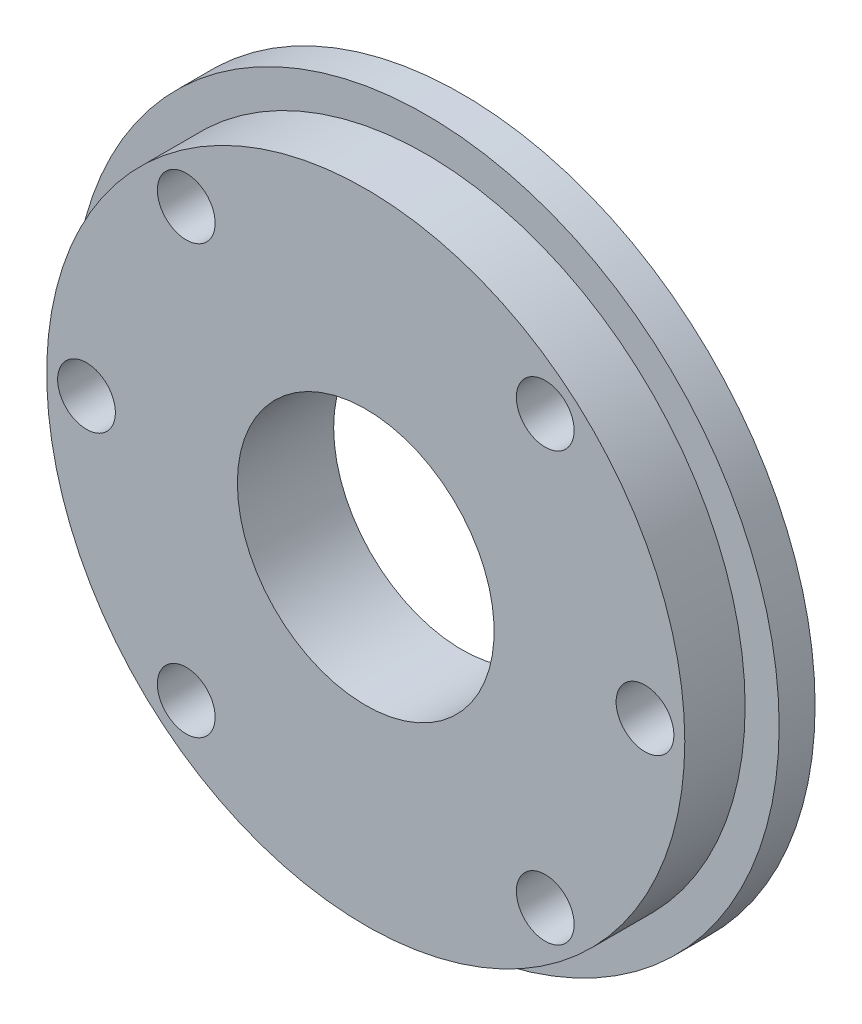
ISO-10303-21;
HEADER;
FILE_DESCRIPTION(('STEP AP214'),'2;1');
FILE_NAME('part.step','',(''),(''),'','','');
FILE_SCHEMA(('AUTOMOTIVE_DESIGN { 1 0 10303 214 1 1 1 1 }'));
ENDSEC;
DATA;
#1=APPLICATION_CONTEXT('core data for automotive mechanical design processes');
#2=APPLICATION_PROTOCOL_DEFINITION('international standard','automotive_design',2000,#1);
#3=PRODUCT_CONTEXT('',#1,'mechanical');
#4=PRODUCT('Part','Part','',(#3));
#5=PRODUCT_RELATED_PRODUCT_CATEGORY('part','',(#4));
#6=PRODUCT_DEFINITION_FORMATION('','',#4);
#7=PRODUCT_DEFINITION_CONTEXT('part definition',#1,'design');
#8=PRODUCT_DEFINITION('design','',#6,#7);
#9=PRODUCT_DEFINITION_SHAPE('','',#8);
#10=(LENGTH_UNIT() NAMED_UNIT(*) SI_UNIT(.MILLI.,.METRE.));
#11=(NAMED_UNIT(*) PLANE_ANGLE_UNIT() SI_UNIT($,.RADIAN.));
#12=(NAMED_UNIT(*) SI_UNIT($,.STERADIAN.) SOLID_ANGLE_UNIT());
#13=UNCERTAINTY_MEASURE_WITH_UNIT(LENGTH_MEASURE(1.E-05),#10,'distance_accuracy_value','');
#14=(GEOMETRIC_REPRESENTATION_CONTEXT(3) GLOBAL_UNCERTAINTY_ASSIGNED_CONTEXT((#13)) GLOBAL_UNIT_ASSIGNED_CONTEXT((#10,
#11,#12)) REPRESENTATION_CONTEXT('',''));
#15=CARTESIAN_POINT('',(0.,0.,0.));
#16=DIRECTION('',(0.,0.,1.));
#17=DIRECTION('',(1.,0.,0.));
#18=AXIS2_PLACEMENT_3D('',#15,#16,#17);
#19=CARTESIAN_POINT('',(0.,0.,7.5));
#20=DIRECTION('',(0.,0.,1.));
#21=DIRECTION('',(1.,0.,0.));
#22=AXIS2_PLACEMENT_3D('',#19,#20,#21);
#23=PLANE('',#22);
#24=CARTESIAN_POINT('',(0.,0.,7.5));
#25=DIRECTION('',(0.,0.,-1.));
#26=DIRECTION('',(-1.,0.,0.));
#27=AXIS2_PLACEMENT_3D('',#24,#25,#26);
#28=CIRCLE('',#27,10.);
#29=CARTESIAN_POINT('',(-10.,0.,7.5));
#30=VERTEX_POINT('',#29);
#31=EDGE_CURVE('E114',#30,#30,#28,.T.);
#32=ORIENTED_EDGE('',*,*,#31,.T.);
#33=EDGE_LOOP('',(#32));
#34=FACE_BOUND('',#33,.T.);
#35=CARTESIAN_POINT('',(21.75,0.,7.5));
#36=DIRECTION('',(0.,0.,1.));
#37=DIRECTION('',(1.,0.,0.));
#38=AXIS2_PLACEMENT_3D('',#35,#36,#37);
#39=CIRCLE('',#38,2.25);
#40=CARTESIAN_POINT('',(24.,0.,7.5));
#41=VERTEX_POINT('',#40);
#42=EDGE_CURVE('E83',#41,#41,#39,.T.);
#43=ORIENTED_EDGE('',*,*,#42,.F.);
#44=EDGE_LOOP('',(#43));
#45=FACE_BOUND('',#44,.T.);
#46=CARTESIAN_POINT('',(-13.9806305106822,-16.6614666378378,7.5));
#47=DIRECTION('',(0.,0.,1.));
#48=DIRECTION('',(1.,0.,0.));
#49=AXIS2_PLACEMENT_3D('',#46,#47,#48);
#50=CIRCLE('',#49,2.25);
#51=CARTESIAN_POINT('',(-11.7306305106822,-16.6614666378378,7.5));
#52=VERTEX_POINT('',#51);
#53=EDGE_CURVE('E67',#52,#52,#50,.T.);
#54=ORIENTED_EDGE('',*,*,#53,.F.);
#55=EDGE_LOOP('',(#54));
#56=FACE_BOUND('',#55,.T.);
#57=CARTESIAN_POINT('',(-21.75,0.,7.5));
#58=DIRECTION('',(0.,0.,1.));
#59=DIRECTION('',(1.,0.,0.));
#60=AXIS2_PLACEMENT_3D('',#57,#58,#59);
#61=CIRCLE('',#60,2.25);
#62=CARTESIAN_POINT('',(-19.5,0.,7.5));
#63=VERTEX_POINT('',#62);
#64=EDGE_CURVE('E50',#63,#63,#61,.T.);
#65=ORIENTED_EDGE('',*,*,#64,.F.);
#66=EDGE_LOOP('',(#65));
#67=FACE_BOUND('',#66,.T.);
#68=CARTESIAN_POINT('',(0.,0.,7.5));
#69=DIRECTION('',(0.,0.,1.));
#70=DIRECTION('',(1.,0.,0.));
#71=AXIS2_PLACEMENT_3D('',#68,#69,#70);
#72=CIRCLE('',#71,24.85);
#73=CARTESIAN_POINT('',(24.85,0.,7.5));
#74=VERTEX_POINT('',#73);
#75=EDGE_CURVE('E10',#74,#74,#72,.T.);
#76=ORIENTED_EDGE('',*,*,#75,.T.);
#77=EDGE_LOOP('',(#76));
#78=FACE_BOUND('',#77,.T.);
#79=CARTESIAN_POINT('',(-13.9806305106822,16.6614666378378,7.5));
#80=DIRECTION('',(0.,0.,1.));
#81=DIRECTION('',(1.,0.,0.));
#82=AXIS2_PLACEMENT_3D('',#79,#80,#81);
#83=CIRCLE('',#82,2.25);
#84=CARTESIAN_POINT('',(-11.7306305106822,16.6614666378378,7.5));
#85=VERTEX_POINT('',#84);
#86=EDGE_CURVE('E61',#85,#85,#83,.T.);
#87=ORIENTED_EDGE('',*,*,#86,.F.);
#88=EDGE_LOOP('',(#87));
#89=FACE_BOUND('',#88,.T.);
#90=CARTESIAN_POINT('',(13.9806305106822,-16.6614666378378,7.5));
#91=DIRECTION('',(0.,0.,1.));
#92=DIRECTION('',(1.,0.,0.));
#93=AXIS2_PLACEMENT_3D('',#90,#91,#92);
#94=CIRCLE('',#93,2.25);
#95=CARTESIAN_POINT('',(16.2306305106822,-16.6614666378378,7.5));
#96=VERTEX_POINT('',#95);
#97=EDGE_CURVE('E75',#96,#96,#94,.T.);
#98=ORIENTED_EDGE('',*,*,#97,.F.);
#99=EDGE_LOOP('',(#98));
#100=FACE_BOUND('',#99,.T.);
#101=CARTESIAN_POINT('',(13.9806305106822,16.6614666378378,7.5));
#102=DIRECTION('',(0.,0.,1.));
#103=DIRECTION('',(1.,0.,0.));
#104=AXIS2_PLACEMENT_3D('',#101,#102,#103);
#105=CIRCLE('',#104,2.25);
#106=CARTESIAN_POINT('',(16.2306305106822,16.6614666378378,7.5));
#107=VERTEX_POINT('',#106);
#108=EDGE_CURVE('E91',#107,#107,#105,.T.);
#109=ORIENTED_EDGE('',*,*,#108,.F.);
#110=EDGE_LOOP('',(#109));
#111=FACE_BOUND('',#110,.T.);
#112=ADVANCED_FACE('F42',(#34,#45,#56,#67,#78,#89,#100,#111),#23,.T.);
#113=CARTESIAN_POINT('',(0.,0.,0.));
#114=DIRECTION('',(0.,0.,1.));
#115=DIRECTION('',(1.,0.,0.));
#116=AXIS2_PLACEMENT_3D('',#113,#114,#115);
#117=PLANE('',#116);
#118=CARTESIAN_POINT('',(0.,0.,0.));
#119=DIRECTION('',(0.,0.,-1.));
#120=DIRECTION('',(-1.,0.,0.));
#121=AXIS2_PLACEMENT_3D('',#118,#119,#120);
#122=CIRCLE('',#121,10.);
#123=CARTESIAN_POINT('',(-10.,0.,0.));
#124=VERTEX_POINT('',#123);
#125=EDGE_CURVE('E115',#124,#124,#122,.T.);
#126=ORIENTED_EDGE('',*,*,#125,.F.);
#127=EDGE_LOOP('',(#126));
#128=FACE_BOUND('',#127,.T.);
#129=CARTESIAN_POINT('',(-21.75,0.,0.));
#130=DIRECTION('',(0.,0.,1.));
#131=DIRECTION('',(1.,0.,0.));
#132=AXIS2_PLACEMENT_3D('',#129,#130,#131);
#133=CIRCLE('',#132,2.25);
#134=CARTESIAN_POINT('',(-19.5,0.,0.));
#135=VERTEX_POINT('',#134);
#136=EDGE_CURVE('E55',#135,#135,#133,.T.);
#137=ORIENTED_EDGE('',*,*,#136,.T.);
#138=EDGE_LOOP('',(#137));
#139=FACE_BOUND('',#138,.T.);
#140=CARTESIAN_POINT('',(-13.9806305106822,16.6614666378378,0.));
#141=DIRECTION('',(0.,0.,1.));
#142=DIRECTION('',(1.,0.,0.));
#143=AXIS2_PLACEMENT_3D('',#140,#141,#142);
#144=CIRCLE('',#143,2.25);
#145=CARTESIAN_POINT('',(-11.7306305106822,16.6614666378378,0.));
#146=VERTEX_POINT('',#145);
#147=EDGE_CURVE('E63',#146,#146,#144,.T.);
#148=ORIENTED_EDGE('',*,*,#147,.T.);
#149=EDGE_LOOP('',(#148));
#150=FACE_BOUND('',#149,.T.);
#151=CARTESIAN_POINT('',(-13.9806305106822,-16.6614666378378,0.));
#152=DIRECTION('',(0.,0.,1.));
#153=DIRECTION('',(1.,0.,0.));
#154=AXIS2_PLACEMENT_3D('',#151,#152,#153);
#155=CIRCLE('',#154,2.25);
#156=CARTESIAN_POINT('',(-11.7306305106822,-16.6614666378378,0.));
#157=VERTEX_POINT('',#156);
#158=EDGE_CURVE('E71',#157,#157,#155,.T.);
#159=ORIENTED_EDGE('',*,*,#158,.T.);
#160=EDGE_LOOP('',(#159));
#161=FACE_BOUND('',#160,.T.);
#162=CARTESIAN_POINT('',(13.9806305106822,-16.6614666378378,0.));
#163=DIRECTION('',(0.,0.,1.));
#164=DIRECTION('',(1.,0.,0.));
#165=AXIS2_PLACEMENT_3D('',#162,#163,#164);
#166=CIRCLE('',#165,2.25);
#167=CARTESIAN_POINT('',(16.2306305106822,-16.6614666378378,0.));
#168=VERTEX_POINT('',#167);
#169=EDGE_CURVE('E79',#168,#168,#166,.T.);
#170=ORIENTED_EDGE('',*,*,#169,.T.);
#171=EDGE_LOOP('',(#170));
#172=FACE_BOUND('',#171,.T.);
#173=CARTESIAN_POINT('',(21.75,0.,0.));
#174=DIRECTION('',(0.,0.,1.));
#175=DIRECTION('',(1.,0.,0.));
#176=AXIS2_PLACEMENT_3D('',#173,#174,#175);
#177=CIRCLE('',#176,2.25);
#178=CARTESIAN_POINT('',(24.,0.,0.));
#179=VERTEX_POINT('',#178);
#180=EDGE_CURVE('E87',#179,#179,#177,.T.);
#181=ORIENTED_EDGE('',*,*,#180,.T.);
#182=EDGE_LOOP('',(#181));
#183=FACE_BOUND('',#182,.T.);
#184=CARTESIAN_POINT('',(13.9806305106822,16.6614666378378,0.));
#185=DIRECTION('',(0.,0.,1.));
#186=DIRECTION('',(1.,0.,0.));
#187=AXIS2_PLACEMENT_3D('',#184,#185,#186);
#188=CIRCLE('',#187,2.25);
#189=CARTESIAN_POINT('',(16.2306305106822,16.6614666378378,0.));
#190=VERTEX_POINT('',#189);
#191=EDGE_CURVE('E95',#190,#190,#188,.T.);
#192=ORIENTED_EDGE('',*,*,#191,.T.);
#193=EDGE_LOOP('',(#192));
#194=FACE_BOUND('',#193,.T.);
#195=CARTESIAN_POINT('',(0.,0.,0.));
#196=DIRECTION('',(0.,0.,1.));
#197=DIRECTION('',(1.,0.,0.));
#198=AXIS2_PLACEMENT_3D('',#195,#196,#197);
#199=CIRCLE('',#198,27.5);
#200=CARTESIAN_POINT('',(27.5,0.,0.));
#201=VERTEX_POINT('',#200);
#202=EDGE_CURVE('E103',#201,#201,#199,.T.);
#203=ORIENTED_EDGE('',*,*,#202,.F.);
#204=EDGE_LOOP('',(#203));
#205=FACE_BOUND('',#204,.T.);
#206=ADVANCED_FACE('F132',(#128,#139,#150,#161,#172,#183,#194,#205),#117,.F.);
#207=CARTESIAN_POINT('',(0.,0.,7.5));
#208=DIRECTION('',(0.,0.,-1.));
#209=DIRECTION('',(-1.,0.,0.));
#210=AXIS2_PLACEMENT_3D('',#207,#208,#209);
#211=CYLINDRICAL_SURFACE('',#210,24.85);
#212=CARTESIAN_POINT('',(0.,0.,2.8));
#213=DIRECTION('',(0.,0.,1.));
#214=DIRECTION('',(1.,0.,0.));
#215=AXIS2_PLACEMENT_3D('',#212,#213,#214);
#216=CIRCLE('',#215,24.85);
#217=CARTESIAN_POINT('',(24.85,0.,2.8));
#218=VERTEX_POINT('',#217);
#219=EDGE_CURVE('E107',#218,#218,#216,.T.);
#220=ORIENTED_EDGE('',*,*,#219,.T.);
#221=EDGE_LOOP('',(#220));
#222=FACE_BOUND('',#221,.T.);
#223=ORIENTED_EDGE('',*,*,#75,.F.);
#224=EDGE_LOOP('',(#223));
#225=FACE_BOUND('',#224,.T.);
#226=ADVANCED_FACE('F44',(#222,#225),#211,.T.);
#227=CARTESIAN_POINT('',(-21.75,0.,7.5));
#228=DIRECTION('',(0.,0.,-1.));
#229=DIRECTION('',(-1.,0.,0.));
#230=AXIS2_PLACEMENT_3D('',#227,#228,#229);
#231=CYLINDRICAL_SURFACE('',#230,2.25);
#232=ORIENTED_EDGE('',*,*,#64,.T.);
#233=EDGE_LOOP('',(#232));
#234=FACE_BOUND('',#233,.T.);
#235=ORIENTED_EDGE('',*,*,#136,.F.);
#236=EDGE_LOOP('',(#235));
#237=FACE_BOUND('',#236,.T.);
#238=ADVANCED_FACE('F166',(#234,#237),#231,.F.);
#239=CARTESIAN_POINT('',(-13.9806305106822,16.6614666378378,7.5));
#240=DIRECTION('',(0.,0.,-1.));
#241=DIRECTION('',(-1.,0.,0.));
#242=AXIS2_PLACEMENT_3D('',#239,#240,#241);
#243=CYLINDRICAL_SURFACE('',#242,2.25);
#244=ORIENTED_EDGE('',*,*,#86,.T.);
#245=EDGE_LOOP('',(#244));
#246=FACE_BOUND('',#245,.T.);
#247=ORIENTED_EDGE('',*,*,#147,.F.);
#248=EDGE_LOOP('',(#247));
#249=FACE_BOUND('',#248,.T.);
#250=ADVANCED_FACE('F169',(#246,#249),#243,.F.);
#251=CARTESIAN_POINT('',(-13.9806305106822,-16.6614666378378,7.5));
#252=DIRECTION('',(0.,0.,-1.));
#253=DIRECTION('',(-1.,0.,0.));
#254=AXIS2_PLACEMENT_3D('',#251,#252,#253);
#255=CYLINDRICAL_SURFACE('',#254,2.25);
#256=ORIENTED_EDGE('',*,*,#53,.T.);
#257=EDGE_LOOP('',(#256));
#258=FACE_BOUND('',#257,.T.);
#259=ORIENTED_EDGE('',*,*,#158,.F.);
#260=EDGE_LOOP('',(#259));
#261=FACE_BOUND('',#260,.T.);
#262=ADVANCED_FACE('F172',(#258,#261),#255,.F.);
#263=CARTESIAN_POINT('',(13.9806305106822,-16.6614666378378,7.5));
#264=DIRECTION('',(0.,0.,-1.));
#265=DIRECTION('',(-1.,0.,0.));
#266=AXIS2_PLACEMENT_3D('',#263,#264,#265);
#267=CYLINDRICAL_SURFACE('',#266,2.25);
#268=ORIENTED_EDGE('',*,*,#97,.T.);
#269=EDGE_LOOP('',(#268));
#270=FACE_BOUND('',#269,.T.);
#271=ORIENTED_EDGE('',*,*,#169,.F.);
#272=EDGE_LOOP('',(#271));
#273=FACE_BOUND('',#272,.T.);
#274=ADVANCED_FACE('F176',(#270,#273),#267,.F.);
#275=CARTESIAN_POINT('',(21.75,0.,7.5));
#276=DIRECTION('',(0.,0.,-1.));
#277=DIRECTION('',(-1.,0.,0.));
#278=AXIS2_PLACEMENT_3D('',#275,#276,#277);
#279=CYLINDRICAL_SURFACE('',#278,2.25);
#280=ORIENTED_EDGE('',*,*,#42,.T.);
#281=EDGE_LOOP('',(#280));
#282=FACE_BOUND('',#281,.T.);
#283=ORIENTED_EDGE('',*,*,#180,.F.);
#284=EDGE_LOOP('',(#283));
#285=FACE_BOUND('',#284,.T.);
#286=ADVANCED_FACE('F180',(#282,#285),#279,.F.);
#287=CARTESIAN_POINT('',(13.9806305106822,16.6614666378378,7.5));
#288=DIRECTION('',(0.,0.,-1.));
#289=DIRECTION('',(-1.,0.,0.));
#290=AXIS2_PLACEMENT_3D('',#287,#288,#289);
#291=CYLINDRICAL_SURFACE('',#290,2.25);
#292=ORIENTED_EDGE('',*,*,#108,.T.);
#293=EDGE_LOOP('',(#292));
#294=FACE_BOUND('',#293,.T.);
#295=ORIENTED_EDGE('',*,*,#191,.F.);
#296=EDGE_LOOP('',(#295));
#297=FACE_BOUND('',#296,.T.);
#298=ADVANCED_FACE('F157',(#294,#297),#291,.F.);
#299=CARTESIAN_POINT('',(0.,0.,2.8));
#300=DIRECTION('',(0.,0.,1.));
#301=DIRECTION('',(1.,0.,0.));
#302=AXIS2_PLACEMENT_3D('',#299,#300,#301);
#303=PLANE('',#302);
#304=CARTESIAN_POINT('',(0.,0.,2.8));
#305=DIRECTION('',(0.,0.,1.));
#306=DIRECTION('',(1.,0.,0.));
#307=AXIS2_PLACEMENT_3D('',#304,#305,#306);
#308=CIRCLE('',#307,27.5);
#309=CARTESIAN_POINT('',(27.5,0.,2.8));
#310=VERTEX_POINT('',#309);
#311=EDGE_CURVE('E99',#310,#310,#308,.T.);
#312=ORIENTED_EDGE('',*,*,#311,.T.);
#313=EDGE_LOOP('',(#312));
#314=FACE_BOUND('',#313,.T.);
#315=ORIENTED_EDGE('',*,*,#219,.F.);
#316=EDGE_LOOP('',(#315));
#317=FACE_BOUND('',#316,.T.);
#318=ADVANCED_FACE('F150',(#314,#317),#303,.T.);
#319=CARTESIAN_POINT('',(0.,0.,2.8));
#320=DIRECTION('',(0.,0.,-1.));
#321=DIRECTION('',(-1.,0.,0.));
#322=AXIS2_PLACEMENT_3D('',#319,#320,#321);
#323=CYLINDRICAL_SURFACE('',#322,27.5);
#324=ORIENTED_EDGE('',*,*,#311,.F.);
#325=EDGE_LOOP('',(#324));
#326=FACE_BOUND('',#325,.T.);
#327=ORIENTED_EDGE('',*,*,#202,.T.);
#328=EDGE_LOOP('',(#327));
#329=FACE_BOUND('',#328,.T.);
#330=ADVANCED_FACE('F128',(#326,#329),#323,.T.);
#331=CARTESIAN_POINT('',(0.,0.,7.5));
#332=DIRECTION('',(0.,0.,-1.));
#333=DIRECTION('',(-1.,0.,0.));
#334=AXIS2_PLACEMENT_3D('',#331,#332,#333);
#335=CYLINDRICAL_SURFACE('',#334,10.);
#336=ORIENTED_EDGE('',*,*,#31,.F.);
#337=EDGE_LOOP('',(#336));
#338=FACE_BOUND('',#337,.T.);
#339=ORIENTED_EDGE('',*,*,#125,.T.);
#340=EDGE_LOOP('',(#339));
#341=FACE_BOUND('',#340,.T.);
#342=ADVANCED_FACE('F125',(#338,#341),#335,.F.);
#343=CLOSED_SHELL('',(#112,#206,#226,#238,#250,#262,#274,#286,#298,#318,#330,#342));
#344=MANIFOLD_SOLID_BREP('B2',#343);
#345=ADVANCED_BREP_SHAPE_REPRESENTATION('',(#18,#344),#14);
#346=SHAPE_DEFINITION_REPRESENTATION(#9,#345);
ENDSEC;
END-ISO-10303-21;
